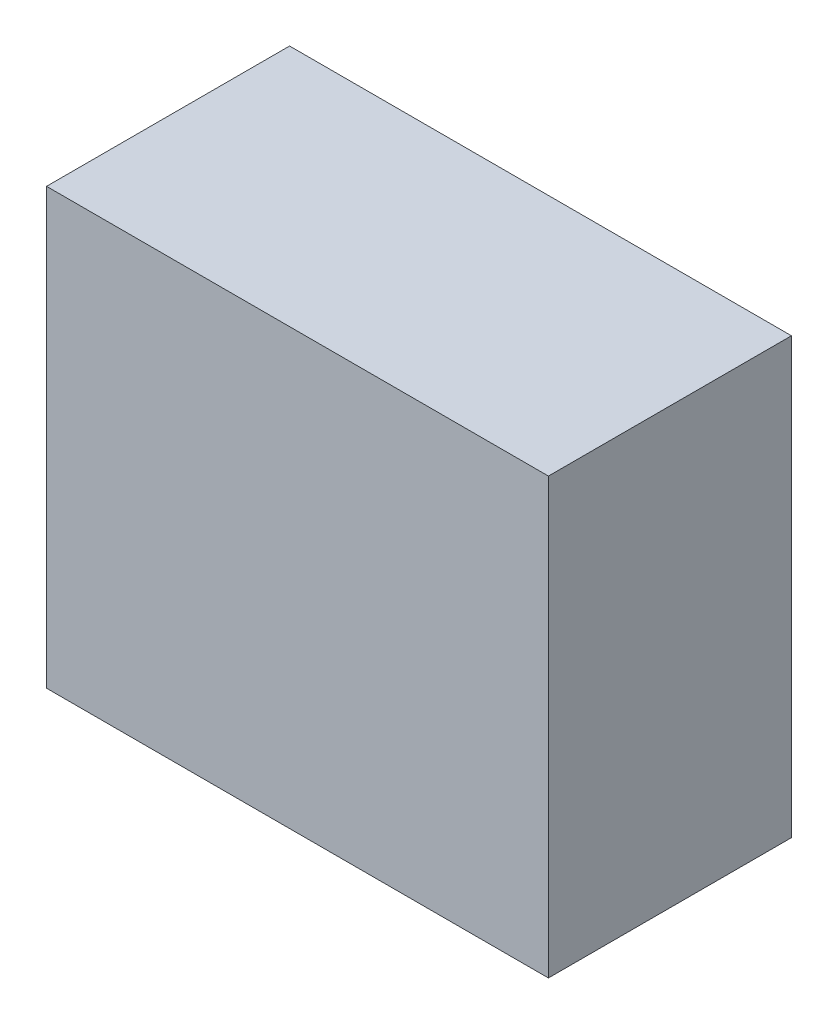
ISO-10303-21;
HEADER;
FILE_DESCRIPTION(('STEP AP214'),'2;1');
FILE_NAME('part.step','',(''),(''),'','','');
FILE_SCHEMA(('AUTOMOTIVE_DESIGN { 1 0 10303 214 1 1 1 1 }'));
ENDSEC;
DATA;
#1=APPLICATION_CONTEXT('core data for automotive mechanical design processes');
#2=APPLICATION_PROTOCOL_DEFINITION('international standard','automotive_design',2000,#1);
#3=PRODUCT_CONTEXT('',#1,'mechanical');
#4=PRODUCT('Part','Part','',(#3));
#5=PRODUCT_RELATED_PRODUCT_CATEGORY('part','',(#4));
#6=PRODUCT_DEFINITION_FORMATION('','',#4);
#7=PRODUCT_DEFINITION_CONTEXT('part definition',#1,'design');
#8=PRODUCT_DEFINITION('design','',#6,#7);
#9=PRODUCT_DEFINITION_SHAPE('','',#8);
#10=(LENGTH_UNIT() NAMED_UNIT(*) SI_UNIT(.MILLI.,.METRE.));
#11=(NAMED_UNIT(*) PLANE_ANGLE_UNIT() SI_UNIT($,.RADIAN.));
#12=(NAMED_UNIT(*) SI_UNIT($,.STERADIAN.) SOLID_ANGLE_UNIT());
#13=UNCERTAINTY_MEASURE_WITH_UNIT(LENGTH_MEASURE(1.E-05),#10,'distance_accuracy_value','');
#14=(GEOMETRIC_REPRESENTATION_CONTEXT(3) GLOBAL_UNCERTAINTY_ASSIGNED_CONTEXT((#13)) GLOBAL_UNIT_ASSIGNED_CONTEXT((#10,
#11,#12)) REPRESENTATION_CONTEXT('',''));
#15=CARTESIAN_POINT('',(0.,0.,0.));
#16=DIRECTION('',(0.,0.,1.));
#17=DIRECTION('',(1.,0.,0.));
#18=AXIS2_PLACEMENT_3D('',#15,#16,#17);
#19=CARTESIAN_POINT('',(7.887793665333E-07,2.712646267292E-06,12.3000008));
#20=DIRECTION('',(0.,0.,1.));
#21=DIRECTION('',(1.,0.,0.));
#22=AXIS2_PLACEMENT_3D('',#19,#20,#21);
#23=PLANE('',#22);
#24=DIRECTION('',(1.,0.,0.));
#25=VECTOR('',#24,1.);
#26=CARTESIAN_POINT('',(7.887793665333E-07,-10.99999578,12.3000008));
#27=LINE('',#26,#25);
#28=CARTESIAN_POINT('',(-12.6999961900003,-10.99999578,12.3000008));
#29=VERTEX_POINT('',#28);
#30=CARTESIAN_POINT('',(12.70000254,-10.99999578,12.3000008));
#31=VERTEX_POINT('',#30);
#32=EDGE_CURVE('E57',#29,#31,#27,.T.);
#33=ORIENTED_EDGE('',*,*,#32,.T.);
#34=DIRECTION('',(0.,1.,0.));
#35=VECTOR('',#34,1.);
#36=CARTESIAN_POINT('',(12.70000254,-10.99999578,12.3000008));
#37=LINE('',#36,#35);
#38=CARTESIAN_POINT('',(12.70000254,11.00000086,12.3000008));
#39=VERTEX_POINT('',#38);
#40=EDGE_CURVE('E84',#31,#39,#37,.T.);
#41=ORIENTED_EDGE('',*,*,#40,.T.);
#42=DIRECTION('',(1.,0.,0.));
#43=VECTOR('',#42,1.);
#44=CARTESIAN_POINT('',(12.70000254,11.00000086,12.3000008));
#45=LINE('',#44,#43);
#46=CARTESIAN_POINT('',(-12.70000254,11.00000086,12.3000008));
#47=VERTEX_POINT('',#46);
#48=EDGE_CURVE('E54',#39,#47,#45,.F.);
#49=ORIENTED_EDGE('',*,*,#48,.T.);
#50=DIRECTION('',(2.30909099242794E-07,-0.999999999999973,0.));
#51=VECTOR('',#50,1.);
#52=CARTESIAN_POINT('',(-12.70000254,11.00000086,12.3000008));
#53=LINE('',#52,#51);
#54=EDGE_CURVE('E20',#47,#29,#53,.T.);
#55=ORIENTED_EDGE('',*,*,#54,.T.);
#56=EDGE_LOOP('',(#33,#41,#49,#55));
#57=FACE_BOUND('',#56,.T.);
#58=ADVANCED_FACE('F17',(#57),#23,.T.);
#59=CARTESIAN_POINT('',(12.70000254,11.00000086,0.));
#60=DIRECTION('',(0.,-1.,0.));
#61=DIRECTION('',(0.,0.,-1.));
#62=AXIS2_PLACEMENT_3D('',#59,#60,#61);
#63=PLANE('',#62);
#64=DIRECTION('',(0.,0.,1.));
#65=VECTOR('',#64,1.);
#66=CARTESIAN_POINT('',(-12.70000254,11.00000086,0.));
#67=LINE('',#66,#65);
#68=CARTESIAN_POINT('',(-12.70000254,11.00000086,0.));
#69=VERTEX_POINT('',#68);
#70=EDGE_CURVE('E62',#69,#47,#67,.T.);
#71=ORIENTED_EDGE('',*,*,#70,.T.);
#72=ORIENTED_EDGE('',*,*,#48,.F.);
#73=DIRECTION('',(0.,0.,1.));
#74=VECTOR('',#73,1.);
#75=CARTESIAN_POINT('',(12.70000254,11.00000086,0.));
#76=LINE('',#75,#74);
#77=CARTESIAN_POINT('',(12.70000254,11.00000086,0.));
#78=VERTEX_POINT('',#77);
#79=EDGE_CURVE('E78',#39,#78,#76,.F.);
#80=ORIENTED_EDGE('',*,*,#79,.T.);
#81=DIRECTION('',(1.,0.,0.));
#82=VECTOR('',#81,1.);
#83=CARTESIAN_POINT('',(7.887793665333E-07,11.00000086,0.));
#84=LINE('',#83,#82);
#85=EDGE_CURVE('E75',#78,#69,#84,.F.);
#86=ORIENTED_EDGE('',*,*,#85,.T.);
#87=EDGE_LOOP('',(#71,#72,#80,#86));
#88=FACE_BOUND('',#87,.T.);
#89=ADVANCED_FACE('F100',(#88),#63,.F.);
#90=CARTESIAN_POINT('',(-12.70000254,11.00000086,0.));
#91=DIRECTION('',(0.999999999999973,2.30909099242794E-07,0.));
#92=DIRECTION('',(-2.30909099242794E-07,0.999999999999973,0.));
#93=AXIS2_PLACEMENT_3D('',#90,#91,#92);
#94=PLANE('',#93);
#95=DIRECTION('',(0.,0.,1.));
#96=VECTOR('',#95,1.);
#97=CARTESIAN_POINT('',(-12.69999492,-10.99999578,0.));
#98=LINE('',#97,#96);
#99=CARTESIAN_POINT('',(-12.6999961900003,-10.99999578,0.));
#100=VERTEX_POINT('',#99);
#101=EDGE_CURVE('E61',#100,#29,#98,.T.);
#102=ORIENTED_EDGE('',*,*,#101,.T.);
#103=ORIENTED_EDGE('',*,*,#54,.F.);
#104=ORIENTED_EDGE('',*,*,#70,.F.);
#105=DIRECTION('',(-2.30909099242794E-07,0.999999999999973,0.));
#106=VECTOR('',#105,1.);
#107=CARTESIAN_POINT('',(-12.70000254,11.00000086,0.));
#108=LINE('',#107,#106);
#109=EDGE_CURVE('E70',#69,#100,#108,.F.);
#110=ORIENTED_EDGE('',*,*,#109,.T.);
#111=EDGE_LOOP('',(#102,#103,#104,#110));
#112=FACE_BOUND('',#111,.T.);
#113=ADVANCED_FACE('F68',(#112),#94,.F.);
#114=CARTESIAN_POINT('',(-12.69999492,-10.99999578,0.));
#115=DIRECTION('',(0.,1.,0.));
#116=DIRECTION('',(0.,0.,1.));
#117=AXIS2_PLACEMENT_3D('',#114,#115,#116);
#118=PLANE('',#117);
#119=DIRECTION('',(0.,0.,1.));
#120=VECTOR('',#119,1.);
#121=CARTESIAN_POINT('',(12.70000254,-10.99999578,0.));
#122=LINE('',#121,#120);
#123=CARTESIAN_POINT('',(12.70000254,-10.99999578,0.));
#124=VERTEX_POINT('',#123);
#125=EDGE_CURVE('E34',#124,#31,#122,.T.);
#126=ORIENTED_EDGE('',*,*,#125,.T.);
#127=ORIENTED_EDGE('',*,*,#32,.F.);
#128=ORIENTED_EDGE('',*,*,#101,.F.);
#129=DIRECTION('',(1.,0.,0.));
#130=VECTOR('',#129,1.);
#131=CARTESIAN_POINT('',(-12.69999492,-10.99999578,0.));
#132=LINE('',#131,#130);
#133=EDGE_CURVE('E26',#100,#124,#132,.T.);
#134=ORIENTED_EDGE('',*,*,#133,.T.);
#135=EDGE_LOOP('',(#126,#127,#128,#134));
#136=FACE_BOUND('',#135,.T.);
#137=ADVANCED_FACE('F64',(#136),#118,.F.);
#138=CARTESIAN_POINT('',(12.70000254,-10.99999578,0.));
#139=DIRECTION('',(-1.,0.,0.));
#140=DIRECTION('',(0.,0.,1.));
#141=AXIS2_PLACEMENT_3D('',#138,#139,#140);
#142=PLANE('',#141);
#143=ORIENTED_EDGE('',*,*,#79,.F.);
#144=ORIENTED_EDGE('',*,*,#40,.F.);
#145=ORIENTED_EDGE('',*,*,#125,.F.);
#146=DIRECTION('',(0.,1.,0.));
#147=VECTOR('',#146,1.);
#148=CARTESIAN_POINT('',(12.70000254,2.712646267292E-06,0.));
#149=LINE('',#148,#147);
#150=EDGE_CURVE('E11',#124,#78,#149,.T.);
#151=ORIENTED_EDGE('',*,*,#150,.T.);
#152=EDGE_LOOP('',(#143,#144,#145,#151));
#153=FACE_BOUND('',#152,.T.);
#154=ADVANCED_FACE('F98',(#153),#142,.F.);
#155=CARTESIAN_POINT('',(7.887793665333E-07,2.712646267292E-06,0.));
#156=DIRECTION('',(0.,0.,1.));
#157=DIRECTION('',(1.,0.,0.));
#158=AXIS2_PLACEMENT_3D('',#155,#156,#157);
#159=PLANE('',#158);
#160=ORIENTED_EDGE('',*,*,#133,.F.);
#161=ORIENTED_EDGE('',*,*,#109,.F.);
#162=ORIENTED_EDGE('',*,*,#85,.F.);
#163=ORIENTED_EDGE('',*,*,#150,.F.);
#164=EDGE_LOOP('',(#160,#161,#162,#163));
#165=FACE_BOUND('',#164,.T.);
#166=ADVANCED_FACE('F95',(#165),#159,.F.);
#167=CLOSED_SHELL('',(#58,#89,#113,#137,#154,#166));
#168=MANIFOLD_SOLID_BREP('B1',#167);
#169=ADVANCED_BREP_SHAPE_REPRESENTATION('',(#18,#168),#14);
#170=SHAPE_DEFINITION_REPRESENTATION(#9,#169);
ENDSEC;
END-ISO-10303-21;
